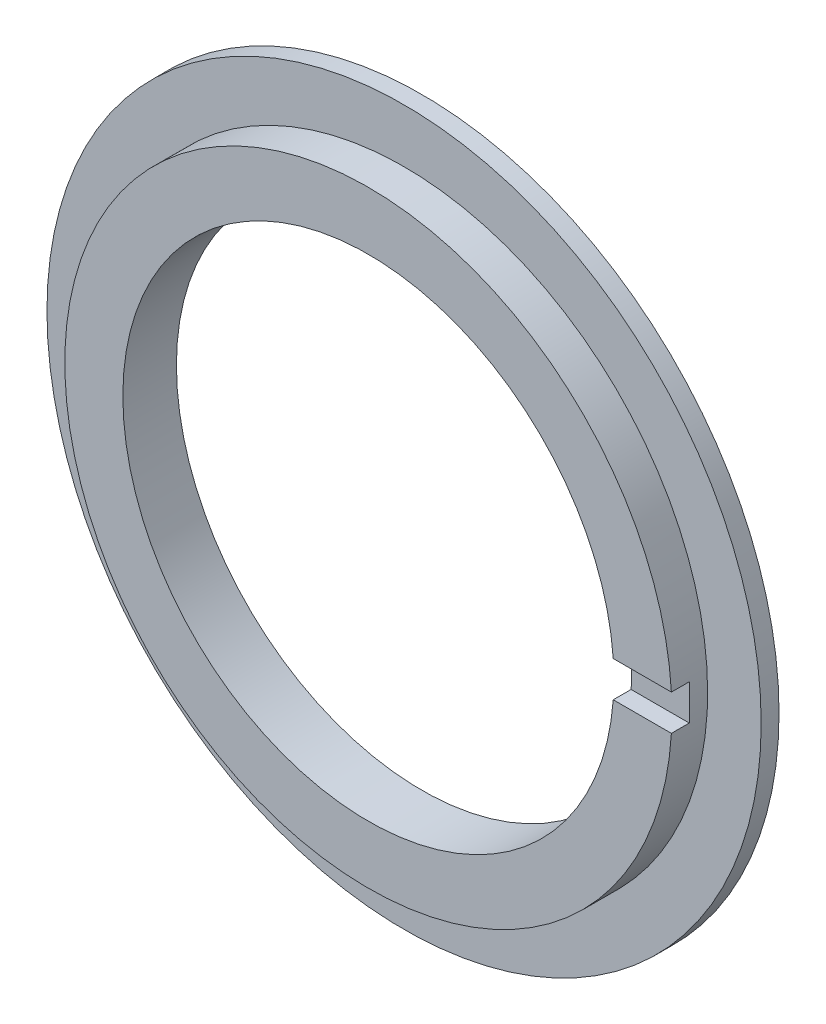
ISO-10303-21;
HEADER;
FILE_DESCRIPTION(('STEP AP214'),'2;1');
FILE_NAME('part.step','',(''),(''),'','','');
FILE_SCHEMA(('AUTOMOTIVE_DESIGN { 1 0 10303 214 1 1 1 1 }'));
ENDSEC;
DATA;
#1=APPLICATION_CONTEXT('core data for automotive mechanical design processes');
#2=APPLICATION_PROTOCOL_DEFINITION('international standard','automotive_design',2000,#1);
#3=PRODUCT_CONTEXT('',#1,'mechanical');
#4=PRODUCT('Part','Part','',(#3));
#5=PRODUCT_RELATED_PRODUCT_CATEGORY('part','',(#4));
#6=PRODUCT_DEFINITION_FORMATION('','',#4);
#7=PRODUCT_DEFINITION_CONTEXT('part definition',#1,'design');
#8=PRODUCT_DEFINITION('design','',#6,#7);
#9=PRODUCT_DEFINITION_SHAPE('','',#8);
#10=(LENGTH_UNIT() NAMED_UNIT(*) SI_UNIT(.MILLI.,.METRE.));
#11=(NAMED_UNIT(*) PLANE_ANGLE_UNIT() SI_UNIT($,.RADIAN.));
#12=(NAMED_UNIT(*) SI_UNIT($,.STERADIAN.) SOLID_ANGLE_UNIT());
#13=UNCERTAINTY_MEASURE_WITH_UNIT(LENGTH_MEASURE(1.E-05),#10,'distance_accuracy_value','');
#14=(GEOMETRIC_REPRESENTATION_CONTEXT(3) GLOBAL_UNCERTAINTY_ASSIGNED_CONTEXT((#13)) GLOBAL_UNIT_ASSIGNED_CONTEXT((#10,
#11,#12)) REPRESENTATION_CONTEXT('',''));
#15=CARTESIAN_POINT('',(0.,0.,0.));
#16=DIRECTION('',(0.,0.,1.));
#17=DIRECTION('',(1.,0.,0.));
#18=AXIS2_PLACEMENT_3D('',#15,#16,#17);
#19=CARTESIAN_POINT('',(0.,0.,2.));
#20=DIRECTION('',(0.,0.,-1.));
#21=DIRECTION('',(-1.,0.,0.));
#22=AXIS2_PLACEMENT_3D('',#19,#20,#21);
#23=CYLINDRICAL_SURFACE('',#22,40.);
#24=CARTESIAN_POINT('',(0.,0.,2.));
#25=DIRECTION('',(0.,0.,1.));
#26=DIRECTION('',(1.,0.,0.));
#27=AXIS2_PLACEMENT_3D('',#24,#25,#26);
#28=CIRCLE('',#27,40.);
#29=CARTESIAN_POINT('',(40.,0.,2.));
#30=VERTEX_POINT('',#29);
#31=EDGE_CURVE('E120',#30,#30,#28,.T.);
#32=ORIENTED_EDGE('',*,*,#31,.F.);
#33=EDGE_LOOP('',(#32));
#34=FACE_BOUND('',#33,.T.);
#35=CARTESIAN_POINT('',(0.,0.,0.));
#36=DIRECTION('',(0.,0.,1.));
#37=DIRECTION('',(1.,0.,0.));
#38=AXIS2_PLACEMENT_3D('',#35,#36,#37);
#39=CIRCLE('',#38,40.);
#40=CARTESIAN_POINT('',(40.,0.,0.));
#41=VERTEX_POINT('',#40);
#42=EDGE_CURVE('E114',#41,#41,#39,.T.);
#43=ORIENTED_EDGE('',*,*,#42,.T.);
#44=EDGE_LOOP('',(#43));
#45=FACE_BOUND('',#44,.T.);
#46=ADVANCED_FACE('F45',(#34,#45),#23,.T.);
#47=CARTESIAN_POINT('',(0.,0.,2.));
#48=DIRECTION('',(0.,0.,1.));
#49=DIRECTION('',(1.,0.,0.));
#50=AXIS2_PLACEMENT_3D('',#47,#48,#49);
#51=PLANE('',#50);
#52=CARTESIAN_POINT('',(0.,0.,2.));
#53=DIRECTION('',(0.,0.,1.));
#54=DIRECTION('',(1.,0.,0.));
#55=AXIS2_PLACEMENT_3D('',#52,#53,#54);
#56=CIRCLE('',#55,34.);
#57=CARTESIAN_POINT('',(34.,0.,2.));
#58=VERTEX_POINT('',#57);
#59=EDGE_CURVE('E108',#58,#58,#56,.F.);
#60=ORIENTED_EDGE('',*,*,#59,.T.);
#61=EDGE_LOOP('',(#60));
#62=FACE_BOUND('',#61,.T.);
#63=ORIENTED_EDGE('',*,*,#31,.T.);
#64=EDGE_LOOP('',(#63));
#65=FACE_BOUND('',#64,.T.);
#66=ADVANCED_FACE('F160',(#62,#65),#51,.T.);
#67=CARTESIAN_POINT('',(0.,0.,0.));
#68=DIRECTION('',(0.,0.,1.));
#69=DIRECTION('',(1.,0.,0.));
#70=AXIS2_PLACEMENT_3D('',#67,#68,#69);
#71=PLANE('',#70);
#72=CARTESIAN_POINT('',(0.,0.,0.));
#73=DIRECTION('',(0.,0.,1.));
#74=DIRECTION('',(1.,0.,0.));
#75=AXIS2_PLACEMENT_3D('',#72,#73,#74);
#76=CIRCLE('',#75,27.5);
#77=CARTESIAN_POINT('',(27.5,0.,0.));
#78=VERTEX_POINT('',#77);
#79=EDGE_CURVE('E109',#78,#78,#76,.T.);
#80=ORIENTED_EDGE('',*,*,#79,.T.);
#81=EDGE_LOOP('',(#80));
#82=FACE_BOUND('',#81,.T.);
#83=ORIENTED_EDGE('',*,*,#42,.F.);
#84=EDGE_LOOP('',(#83));
#85=FACE_BOUND('',#84,.T.);
#86=ADVANCED_FACE('F165',(#82,#85),#71,.F.);
#87=CARTESIAN_POINT('',(0.,0.,6.));
#88=DIRECTION('',(0.,0.,-1.));
#89=DIRECTION('',(-1.,0.,0.));
#90=AXIS2_PLACEMENT_3D('',#87,#88,#89);
#91=CYLINDRICAL_SURFACE('',#90,34.);
#92=ORIENTED_EDGE('',*,*,#59,.F.);
#93=EDGE_LOOP('',(#92));
#94=FACE_BOUND('',#93,.T.);
#95=CARTESIAN_POINT('',(0.,0.,4.));
#96=DIRECTION('',(0.,0.,-1.));
#97=DIRECTION('',(-1.,0.,0.));
#98=AXIS2_PLACEMENT_3D('',#95,#96,#97);
#99=CIRCLE('',#98,34.);
#100=CARTESIAN_POINT('',(33.9411254969543,2.,4.));
#101=VERTEX_POINT('',#100);
#102=CARTESIAN_POINT('',(33.9411254969543,-2.,4.));
#103=VERTEX_POINT('',#102);
#104=EDGE_CURVE('E65',#101,#103,#99,.T.);
#105=ORIENTED_EDGE('',*,*,#104,.T.);
#106=DIRECTION('',(0.,0.,-1.));
#107=VECTOR('',#106,1.);
#108=CARTESIAN_POINT('',(33.9411254969543,-2.,6.));
#109=LINE('',#108,#107);
#110=CARTESIAN_POINT('',(33.9411254969543,-2.,6.));
#111=VERTEX_POINT('',#110);
#112=EDGE_CURVE('E92',#103,#111,#109,.F.);
#113=ORIENTED_EDGE('',*,*,#112,.T.);
#114=CARTESIAN_POINT('',(0.,0.,6.));
#115=DIRECTION('',(0.,0.,1.));
#116=DIRECTION('',(1.,0.,0.));
#117=AXIS2_PLACEMENT_3D('',#114,#115,#116);
#118=CIRCLE('',#117,34.);
#119=CARTESIAN_POINT('',(33.9411254969543,2.,6.));
#120=VERTEX_POINT('',#119);
#121=EDGE_CURVE('E99',#120,#111,#118,.T.);
#122=ORIENTED_EDGE('',*,*,#121,.F.);
#123=DIRECTION('',(0.,0.,-1.));
#124=VECTOR('',#123,1.);
#125=CARTESIAN_POINT('',(33.9411254969543,2.,6.));
#126=LINE('',#125,#124);
#127=EDGE_CURVE('E84',#120,#101,#126,.T.);
#128=ORIENTED_EDGE('',*,*,#127,.T.);
#129=EDGE_LOOP('',(#105,#113,#122,#128));
#130=FACE_BOUND('',#129,.T.);
#131=ADVANCED_FACE('F106',(#94,#130),#91,.T.);
#132=CARTESIAN_POINT('',(0.,0.,6.));
#133=DIRECTION('',(0.,0.,1.));
#134=DIRECTION('',(1.,0.,0.));
#135=AXIS2_PLACEMENT_3D('',#132,#133,#134);
#136=PLANE('',#135);
#137=DIRECTION('',(1.,0.,0.));
#138=VECTOR('',#137,1.);
#139=CARTESIAN_POINT('',(6.93487083694385,-2.,6.));
#140=LINE('',#139,#138);
#141=CARTESIAN_POINT('',(27.427176303805,-2.,6.));
#142=VERTEX_POINT('',#141);
#143=EDGE_CURVE('E103',#142,#111,#140,.T.);
#144=ORIENTED_EDGE('',*,*,#143,.F.);
#145=CARTESIAN_POINT('',(0.,0.,6.));
#146=DIRECTION('',(0.,0.,1.));
#147=DIRECTION('',(1.,0.,0.));
#148=AXIS2_PLACEMENT_3D('',#145,#146,#147);
#149=CIRCLE('',#148,27.5);
#150=CARTESIAN_POINT('',(27.427176303805,2.,6.));
#151=VERTEX_POINT('',#150);
#152=EDGE_CURVE('E101',#151,#142,#149,.T.);
#153=ORIENTED_EDGE('',*,*,#152,.F.);
#154=DIRECTION('',(-1.,0.,0.));
#155=VECTOR('',#154,1.);
#156=CARTESIAN_POINT('',(6.93487083694385,2.,6.));
#157=LINE('',#156,#155);
#158=EDGE_CURVE('E87',#120,#151,#157,.T.);
#159=ORIENTED_EDGE('',*,*,#158,.F.);
#160=ORIENTED_EDGE('',*,*,#121,.T.);
#161=EDGE_LOOP('',(#144,#153,#159,#160));
#162=FACE_BOUND('',#161,.T.);
#163=ADVANCED_FACE('F98',(#162),#136,.T.);
#164=CARTESIAN_POINT('',(0.,0.,0.));
#165=DIRECTION('',(0.,0.,1.));
#166=DIRECTION('',(1.,0.,0.));
#167=AXIS2_PLACEMENT_3D('',#164,#165,#166);
#168=CYLINDRICAL_SURFACE('',#167,27.5);
#169=ORIENTED_EDGE('',*,*,#152,.T.);
#170=DIRECTION('',(0.,0.,1.));
#171=VECTOR('',#170,1.);
#172=CARTESIAN_POINT('',(27.427176303805,-2.,0.));
#173=LINE('',#172,#171);
#174=CARTESIAN_POINT('',(27.427176303805,-2.,4.));
#175=VERTEX_POINT('',#174);
#176=EDGE_CURVE('E11',#142,#175,#173,.F.);
#177=ORIENTED_EDGE('',*,*,#176,.T.);
#178=CARTESIAN_POINT('',(0.,0.,4.));
#179=DIRECTION('',(0.,0.,-1.));
#180=DIRECTION('',(-1.,0.,0.));
#181=AXIS2_PLACEMENT_3D('',#178,#179,#180);
#182=CIRCLE('',#181,27.5);
#183=CARTESIAN_POINT('',(27.427176303805,2.,4.));
#184=VERTEX_POINT('',#183);
#185=EDGE_CURVE('E124',#175,#184,#182,.F.);
#186=ORIENTED_EDGE('',*,*,#185,.T.);
#187=DIRECTION('',(0.,0.,1.));
#188=VECTOR('',#187,1.);
#189=CARTESIAN_POINT('',(27.427176303805,2.,0.));
#190=LINE('',#189,#188);
#191=EDGE_CURVE('E53',#184,#151,#190,.T.);
#192=ORIENTED_EDGE('',*,*,#191,.T.);
#193=EDGE_LOOP('',(#169,#177,#186,#192));
#194=FACE_BOUND('',#193,.T.);
#195=ORIENTED_EDGE('',*,*,#79,.F.);
#196=EDGE_LOOP('',(#195));
#197=FACE_BOUND('',#196,.T.);
#198=ADVANCED_FACE('F132',(#194,#197),#168,.F.);
#199=CARTESIAN_POINT('',(6.93487083694385,-2.,4.));
#200=DIRECTION('',(0.,-1.,0.));
#201=DIRECTION('',(0.,0.,-1.));
#202=AXIS2_PLACEMENT_3D('',#199,#200,#201);
#203=PLANE('',#202);
#204=DIRECTION('',(1.,0.,0.));
#205=VECTOR('',#204,1.);
#206=CARTESIAN_POINT('',(6.93487083694385,-2.,4.));
#207=LINE('',#206,#205);
#208=EDGE_CURVE('E136',#175,#103,#207,.T.);
#209=ORIENTED_EDGE('',*,*,#208,.F.);
#210=ORIENTED_EDGE('',*,*,#176,.F.);
#211=ORIENTED_EDGE('',*,*,#143,.T.);
#212=ORIENTED_EDGE('',*,*,#112,.F.);
#213=EDGE_LOOP('',(#209,#210,#211,#212));
#214=FACE_BOUND('',#213,.T.);
#215=ADVANCED_FACE('F138',(#214),#203,.F.);
#216=CARTESIAN_POINT('',(6.93487083694385,2.,4.));
#217=DIRECTION('',(0.,1.,0.));
#218=DIRECTION('',(0.,0.,1.));
#219=AXIS2_PLACEMENT_3D('',#216,#217,#218);
#220=PLANE('',#219);
#221=ORIENTED_EDGE('',*,*,#158,.T.);
#222=ORIENTED_EDGE('',*,*,#191,.F.);
#223=DIRECTION('',(-1.,0.,0.));
#224=VECTOR('',#223,1.);
#225=CARTESIAN_POINT('',(6.93487083694385,2.,4.));
#226=LINE('',#225,#224);
#227=EDGE_CURVE('E60',#101,#184,#226,.T.);
#228=ORIENTED_EDGE('',*,*,#227,.F.);
#229=ORIENTED_EDGE('',*,*,#127,.F.);
#230=EDGE_LOOP('',(#221,#222,#228,#229));
#231=FACE_BOUND('',#230,.T.);
#232=ADVANCED_FACE('F86',(#231),#220,.F.);
#233=CARTESIAN_POINT('',(0.,0.,4.));
#234=DIRECTION('',(0.,0.,-1.));
#235=DIRECTION('',(-1.,0.,0.));
#236=AXIS2_PLACEMENT_3D('',#233,#234,#235);
#237=PLANE('',#236);
#238=ORIENTED_EDGE('',*,*,#227,.T.);
#239=ORIENTED_EDGE('',*,*,#185,.F.);
#240=ORIENTED_EDGE('',*,*,#208,.T.);
#241=ORIENTED_EDGE('',*,*,#104,.F.);
#242=EDGE_LOOP('',(#238,#239,#240,#241));
#243=FACE_BOUND('',#242,.T.);
#244=ADVANCED_FACE('F135',(#243),#237,.F.);
#245=CLOSED_SHELL('',(#46,#66,#86,#131,#163,#198,#215,#232,#244));
#246=MANIFOLD_SOLID_BREP('B2',#245);
#247=ADVANCED_BREP_SHAPE_REPRESENTATION('',(#18,#246),#14);
#248=SHAPE_DEFINITION_REPRESENTATION(#9,#247);
ENDSEC;
END-ISO-10303-21;
